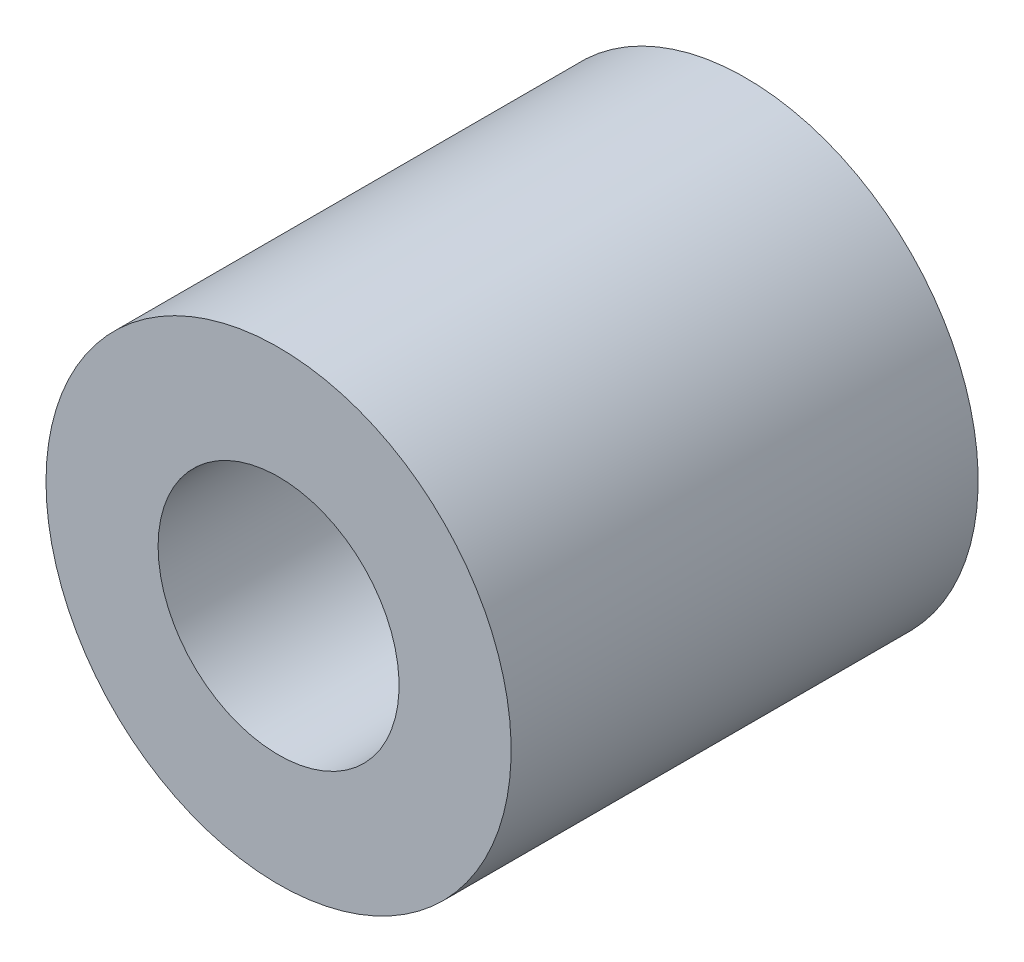
ISO-10303-21;
HEADER;
FILE_DESCRIPTION(('STEP AP214'),'2;1');
FILE_NAME('part.step','',(''),(''),'','','');
FILE_SCHEMA(('AUTOMOTIVE_DESIGN { 1 0 10303 214 1 1 1 1 }'));
ENDSEC;
DATA;
#1=APPLICATION_CONTEXT('core data for automotive mechanical design processes');
#2=APPLICATION_PROTOCOL_DEFINITION('international standard','automotive_design',2000,#1);
#3=PRODUCT_CONTEXT('',#1,'mechanical');
#4=PRODUCT('Part','Part','',(#3));
#5=PRODUCT_RELATED_PRODUCT_CATEGORY('part','',(#4));
#6=PRODUCT_DEFINITION_FORMATION('','',#4);
#7=PRODUCT_DEFINITION_CONTEXT('part definition',#1,'design');
#8=PRODUCT_DEFINITION('design','',#6,#7);
#9=PRODUCT_DEFINITION_SHAPE('','',#8);
#10=(LENGTH_UNIT() NAMED_UNIT(*) SI_UNIT(.MILLI.,.METRE.));
#11=(NAMED_UNIT(*) PLANE_ANGLE_UNIT() SI_UNIT($,.RADIAN.));
#12=(NAMED_UNIT(*) SI_UNIT($,.STERADIAN.) SOLID_ANGLE_UNIT());
#13=UNCERTAINTY_MEASURE_WITH_UNIT(LENGTH_MEASURE(1.E-05),#10,'distance_accuracy_value','');
#14=(GEOMETRIC_REPRESENTATION_CONTEXT(3) GLOBAL_UNCERTAINTY_ASSIGNED_CONTEXT((#13)) GLOBAL_UNIT_ASSIGNED_CONTEXT((#10,
#11,#12)) REPRESENTATION_CONTEXT('',''));
#15=CARTESIAN_POINT('',(0.,0.,0.));
#16=DIRECTION('',(0.,0.,1.));
#17=DIRECTION('',(1.,0.,0.));
#18=AXIS2_PLACEMENT_3D('',#15,#16,#17);
#19=CARTESIAN_POINT('',(0.,0.,6.35));
#20=DIRECTION('',(0.,0.,-1.));
#21=DIRECTION('',(-1.,0.,0.));
#22=AXIS2_PLACEMENT_3D('',#19,#20,#21);
#23=CYLINDRICAL_SURFACE('',#22,3.2766);
#24=CARTESIAN_POINT('',(0.,0.,-6.35));
#25=DIRECTION('',(0.,0.,-1.));
#26=DIRECTION('',(-1.,0.,0.));
#27=AXIS2_PLACEMENT_3D('',#24,#25,#26);
#28=CIRCLE('',#27,3.2766);
#29=CARTESIAN_POINT('',(-3.2766,0.,-6.35));
#30=VERTEX_POINT('',#29);
#31=EDGE_CURVE('E27',#30,#30,#28,.T.);
#32=ORIENTED_EDGE('',*,*,#31,.T.);
#33=EDGE_LOOP('',(#32));
#34=FACE_BOUND('',#33,.T.);
#35=CARTESIAN_POINT('',(0.,0.,6.35));
#36=DIRECTION('',(0.,0.,-1.));
#37=DIRECTION('',(-1.,0.,0.));
#38=AXIS2_PLACEMENT_3D('',#35,#36,#37);
#39=CIRCLE('',#38,3.2766);
#40=CARTESIAN_POINT('',(-3.2766,0.,6.35));
#41=VERTEX_POINT('',#40);
#42=EDGE_CURVE('E18',#41,#41,#39,.T.);
#43=ORIENTED_EDGE('',*,*,#42,.F.);
#44=EDGE_LOOP('',(#43));
#45=FACE_BOUND('',#44,.T.);
#46=ADVANCED_FACE('F15',(#34,#45),#23,.F.);
#47=CARTESIAN_POINT('',(0.,0.,6.35));
#48=DIRECTION('',(0.,0.,1.));
#49=DIRECTION('',(1.,0.,0.));
#50=AXIS2_PLACEMENT_3D('',#47,#48,#49);
#51=PLANE('',#50);
#52=ORIENTED_EDGE('',*,*,#42,.T.);
#53=EDGE_LOOP('',(#52));
#54=FACE_BOUND('',#53,.T.);
#55=CARTESIAN_POINT('',(0.,0.,6.35));
#56=DIRECTION('',(0.,0.,-1.));
#57=DIRECTION('',(-1.,0.,0.));
#58=AXIS2_PLACEMENT_3D('',#55,#56,#57);
#59=CIRCLE('',#58,6.3246);
#60=CARTESIAN_POINT('',(-6.3246,0.,6.35));
#61=VERTEX_POINT('',#60);
#62=EDGE_CURVE('E22',#61,#61,#59,.T.);
#63=ORIENTED_EDGE('',*,*,#62,.F.);
#64=EDGE_LOOP('',(#63));
#65=FACE_BOUND('',#64,.T.);
#66=ADVANCED_FACE('F35',(#54,#65),#51,.T.);
#67=CARTESIAN_POINT('',(0.,0.,-6.35));
#68=DIRECTION('',(0.,0.,1.));
#69=DIRECTION('',(1.,0.,0.));
#70=AXIS2_PLACEMENT_3D('',#67,#68,#69);
#71=PLANE('',#70);
#72=ORIENTED_EDGE('',*,*,#31,.F.);
#73=EDGE_LOOP('',(#72));
#74=FACE_BOUND('',#73,.T.);
#75=CARTESIAN_POINT('',(0.,0.,-6.35));
#76=DIRECTION('',(0.,0.,-1.));
#77=DIRECTION('',(-1.,0.,0.));
#78=AXIS2_PLACEMENT_3D('',#75,#76,#77);
#79=CIRCLE('',#78,6.3246);
#80=CARTESIAN_POINT('',(-6.3246,0.,-6.35));
#81=VERTEX_POINT('',#80);
#82=EDGE_CURVE('E10',#81,#81,#79,.F.);
#83=ORIENTED_EDGE('',*,*,#82,.F.);
#84=EDGE_LOOP('',(#83));
#85=FACE_BOUND('',#84,.T.);
#86=ADVANCED_FACE('F43',(#74,#85),#71,.F.);
#87=CARTESIAN_POINT('',(0.,0.,6.35));
#88=DIRECTION('',(0.,0.,-1.));
#89=DIRECTION('',(-1.,0.,0.));
#90=AXIS2_PLACEMENT_3D('',#87,#88,#89);
#91=CYLINDRICAL_SURFACE('',#90,6.3246);
#92=ORIENTED_EDGE('',*,*,#82,.T.);
#93=EDGE_LOOP('',(#92));
#94=FACE_BOUND('',#93,.T.);
#95=ORIENTED_EDGE('',*,*,#62,.T.);
#96=EDGE_LOOP('',(#95));
#97=FACE_BOUND('',#96,.T.);
#98=ADVANCED_FACE('F44',(#94,#97),#91,.T.);
#99=CLOSED_SHELL('',(#46,#66,#86,#98));
#100=MANIFOLD_SOLID_BREP('B1',#99);
#101=ADVANCED_BREP_SHAPE_REPRESENTATION('',(#18,#100),#14);
#102=SHAPE_DEFINITION_REPRESENTATION(#9,#101);
ENDSEC;
END-ISO-10303-21;
